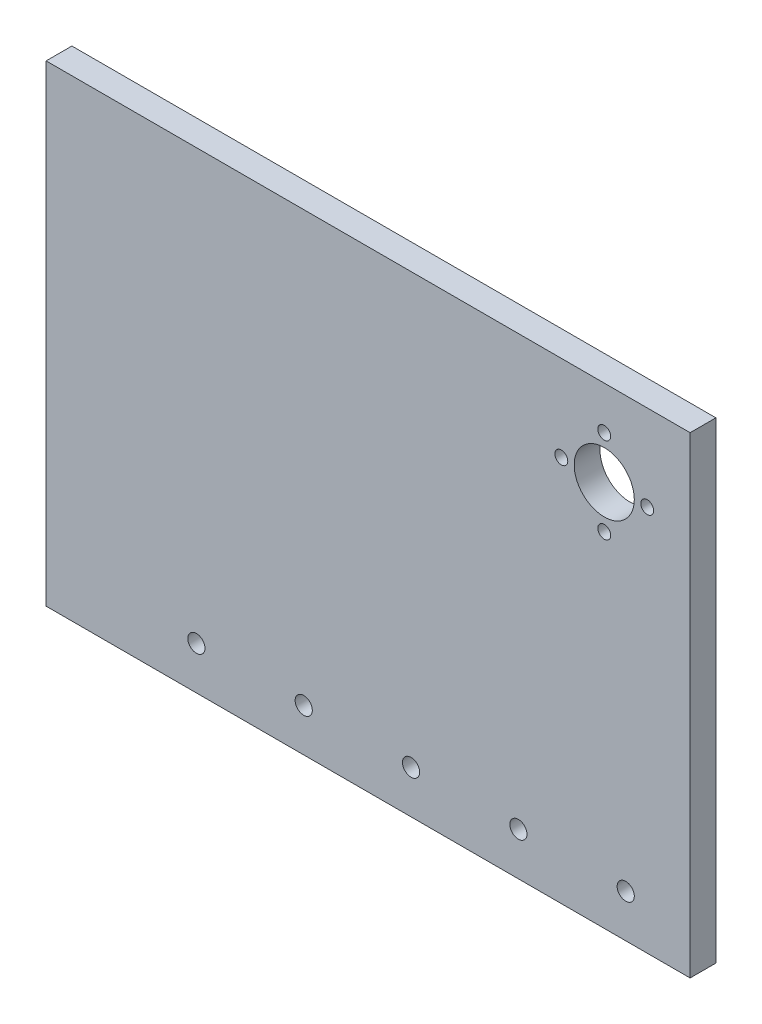
ISO-10303-21;
HEADER;
FILE_DESCRIPTION(('STEP AP214'),'2;1');
FILE_NAME('part.step','',(''),(''),'','','');
FILE_SCHEMA(('AUTOMOTIVE_DESIGN { 1 0 10303 214 1 1 1 1 }'));
ENDSEC;
DATA;
#1=APPLICATION_CONTEXT('core data for automotive mechanical design processes');
#2=APPLICATION_PROTOCOL_DEFINITION('international standard','automotive_design',2000,#1);
#3=PRODUCT_CONTEXT('',#1,'mechanical');
#4=PRODUCT('Part','Part','',(#3));
#5=PRODUCT_RELATED_PRODUCT_CATEGORY('part','',(#4));
#6=PRODUCT_DEFINITION_FORMATION('','',#4);
#7=PRODUCT_DEFINITION_CONTEXT('part definition',#1,'design');
#8=PRODUCT_DEFINITION('design','',#6,#7);
#9=PRODUCT_DEFINITION_SHAPE('','',#8);
#10=(LENGTH_UNIT() NAMED_UNIT(*) SI_UNIT(.MILLI.,.METRE.));
#11=(NAMED_UNIT(*) PLANE_ANGLE_UNIT() SI_UNIT($,.RADIAN.));
#12=(NAMED_UNIT(*) SI_UNIT($,.STERADIAN.) SOLID_ANGLE_UNIT());
#13=UNCERTAINTY_MEASURE_WITH_UNIT(LENGTH_MEASURE(1.E-05),#10,'distance_accuracy_value','');
#14=(GEOMETRIC_REPRESENTATION_CONTEXT(3) GLOBAL_UNCERTAINTY_ASSIGNED_CONTEXT((#13)) GLOBAL_UNIT_ASSIGNED_CONTEXT((#10,
#11,#12)) REPRESENTATION_CONTEXT('',''));
#15=CARTESIAN_POINT('',(0.,0.,0.));
#16=DIRECTION('',(0.,0.,1.));
#17=DIRECTION('',(1.,0.,0.));
#18=AXIS2_PLACEMENT_3D('',#15,#16,#17);
#19=CARTESIAN_POINT('',(0.,0.,6.));
#20=DIRECTION('',(1.,0.,0.));
#21=DIRECTION('',(0.,0.,-1.));
#22=AXIS2_PLACEMENT_3D('',#19,#20,#21);
#23=PLANE('',#22);
#24=DIRECTION('',(0.,-1.,0.));
#25=VECTOR('',#24,1.);
#26=CARTESIAN_POINT('',(0.,0.,0.));
#27=LINE('',#26,#25);
#28=CARTESIAN_POINT('',(0.,110.,0.));
#29=VERTEX_POINT('',#28);
#30=CARTESIAN_POINT('',(0.,0.,0.));
#31=VERTEX_POINT('',#30);
#32=EDGE_CURVE('E96',#29,#31,#27,.T.);
#33=ORIENTED_EDGE('',*,*,#32,.T.);
#34=DIRECTION('',(0.,0.,-1.));
#35=VECTOR('',#34,1.);
#36=CARTESIAN_POINT('',(0.,0.,6.));
#37=LINE('',#36,#35);
#38=CARTESIAN_POINT('',(0.,0.,6.));
#39=VERTEX_POINT('',#38);
#40=EDGE_CURVE('E11',#39,#31,#37,.T.);
#41=ORIENTED_EDGE('',*,*,#40,.F.);
#42=DIRECTION('',(0.,-1.,0.));
#43=VECTOR('',#42,1.);
#44=CARTESIAN_POINT('',(0.,0.,6.));
#45=LINE('',#44,#43);
#46=CARTESIAN_POINT('',(0.,110.,6.));
#47=VERTEX_POINT('',#46);
#48=EDGE_CURVE('E84',#47,#39,#45,.T.);
#49=ORIENTED_EDGE('',*,*,#48,.F.);
#50=DIRECTION('',(0.,0.,-1.));
#51=VECTOR('',#50,1.);
#52=CARTESIAN_POINT('',(0.,110.,6.));
#53=LINE('',#52,#51);
#54=EDGE_CURVE('E92',#47,#29,#53,.T.);
#55=ORIENTED_EDGE('',*,*,#54,.T.);
#56=EDGE_LOOP('',(#33,#41,#49,#55));
#57=FACE_BOUND('',#56,.T.);
#58=ADVANCED_FACE('F33',(#57),#23,.F.);
#59=CARTESIAN_POINT('',(0.,0.,6.));
#60=DIRECTION('',(0.,1.,0.));
#61=DIRECTION('',(0.,0.,1.));
#62=AXIS2_PLACEMENT_3D('',#59,#60,#61);
#63=PLANE('',#62);
#64=DIRECTION('',(1.,0.,0.));
#65=VECTOR('',#64,1.);
#66=CARTESIAN_POINT('',(0.,0.,0.));
#67=LINE('',#66,#65);
#68=CARTESIAN_POINT('',(150.,0.,0.));
#69=VERTEX_POINT('',#68);
#70=EDGE_CURVE('E88',#31,#69,#67,.T.);
#71=ORIENTED_EDGE('',*,*,#70,.T.);
#72=DIRECTION('',(0.,0.,-1.));
#73=VECTOR('',#72,1.);
#74=CARTESIAN_POINT('',(150.,0.,6.));
#75=LINE('',#74,#73);
#76=CARTESIAN_POINT('',(150.,0.,6.));
#77=VERTEX_POINT('',#76);
#78=EDGE_CURVE('E41',#77,#69,#75,.T.);
#79=ORIENTED_EDGE('',*,*,#78,.F.);
#80=DIRECTION('',(1.,0.,0.));
#81=VECTOR('',#80,1.);
#82=CARTESIAN_POINT('',(0.,0.,6.));
#83=LINE('',#82,#81);
#84=EDGE_CURVE('E79',#39,#77,#83,.T.);
#85=ORIENTED_EDGE('',*,*,#84,.F.);
#86=ORIENTED_EDGE('',*,*,#40,.T.);
#87=EDGE_LOOP('',(#71,#79,#85,#86));
#88=FACE_BOUND('',#87,.T.);
#89=ADVANCED_FACE('F87',(#88),#63,.F.);
#90=CARTESIAN_POINT('',(150.,0.,6.));
#91=DIRECTION('',(-1.,0.,0.));
#92=DIRECTION('',(0.,0.,1.));
#93=AXIS2_PLACEMENT_3D('',#90,#91,#92);
#94=PLANE('',#93);
#95=DIRECTION('',(0.,1.,0.));
#96=VECTOR('',#95,1.);
#97=CARTESIAN_POINT('',(150.,0.,0.));
#98=LINE('',#97,#96);
#99=CARTESIAN_POINT('',(150.,110.,0.));
#100=VERTEX_POINT('',#99);
#101=EDGE_CURVE('E66',#69,#100,#98,.T.);
#102=ORIENTED_EDGE('',*,*,#101,.T.);
#103=DIRECTION('',(0.,0.,-1.));
#104=VECTOR('',#103,1.);
#105=CARTESIAN_POINT('',(150.,110.,6.));
#106=LINE('',#105,#104);
#107=CARTESIAN_POINT('',(150.,110.,6.));
#108=VERTEX_POINT('',#107);
#109=EDGE_CURVE('E89',#108,#100,#106,.T.);
#110=ORIENTED_EDGE('',*,*,#109,.F.);
#111=DIRECTION('',(0.,1.,0.));
#112=VECTOR('',#111,1.);
#113=CARTESIAN_POINT('',(150.,0.,6.));
#114=LINE('',#113,#112);
#115=EDGE_CURVE('E82',#77,#108,#114,.T.);
#116=ORIENTED_EDGE('',*,*,#115,.F.);
#117=ORIENTED_EDGE('',*,*,#78,.T.);
#118=EDGE_LOOP('',(#102,#110,#116,#117));
#119=FACE_BOUND('',#118,.T.);
#120=ADVANCED_FACE('F90',(#119),#94,.F.);
#121=CARTESIAN_POINT('',(0.,110.,6.));
#122=DIRECTION('',(0.,-1.,0.));
#123=DIRECTION('',(0.,0.,-1.));
#124=AXIS2_PLACEMENT_3D('',#121,#122,#123);
#125=PLANE('',#124);
#126=DIRECTION('',(-1.,0.,0.));
#127=VECTOR('',#126,1.);
#128=CARTESIAN_POINT('',(0.,110.,0.));
#129=LINE('',#128,#127);
#130=EDGE_CURVE('E72',#100,#29,#129,.T.);
#131=ORIENTED_EDGE('',*,*,#130,.T.);
#132=ORIENTED_EDGE('',*,*,#54,.F.);
#133=DIRECTION('',(-1.,0.,0.));
#134=VECTOR('',#133,1.);
#135=CARTESIAN_POINT('',(0.,110.,6.));
#136=LINE('',#135,#134);
#137=EDGE_CURVE('E49',#108,#47,#136,.T.);
#138=ORIENTED_EDGE('',*,*,#137,.F.);
#139=ORIENTED_EDGE('',*,*,#109,.T.);
#140=EDGE_LOOP('',(#131,#132,#138,#139));
#141=FACE_BOUND('',#140,.T.);
#142=ADVANCED_FACE('F104',(#141),#125,.F.);
#143=CARTESIAN_POINT('',(0.,0.,6.));
#144=DIRECTION('',(0.,0.,-1.));
#145=DIRECTION('',(-1.,0.,0.));
#146=AXIS2_PLACEMENT_3D('',#143,#144,#145);
#147=PLANE('',#146);
#148=CARTESIAN_POINT('',(140.,90.,6.));
#149=DIRECTION('',(0.,0.,1.));
#150=DIRECTION('',(1.,0.,0.));
#151=AXIS2_PLACEMENT_3D('',#148,#149,#150);
#152=CIRCLE('',#151,1.5);
#153=CARTESIAN_POINT('',(141.5,90.,6.));
#154=VERTEX_POINT('',#153);
#155=EDGE_CURVE('E164',#154,#154,#152,.T.);
#156=ORIENTED_EDGE('',*,*,#155,.F.);
#157=EDGE_LOOP('',(#156));
#158=FACE_BOUND('',#157,.T.);
#159=CARTESIAN_POINT('',(130.,80.,6.));
#160=DIRECTION('',(0.,0.,1.));
#161=DIRECTION('',(1.,0.,0.));
#162=AXIS2_PLACEMENT_3D('',#159,#160,#161);
#163=CIRCLE('',#162,1.5);
#164=CARTESIAN_POINT('',(131.5,80.,6.));
#165=VERTEX_POINT('',#164);
#166=EDGE_CURVE('E158',#165,#165,#163,.T.);
#167=ORIENTED_EDGE('',*,*,#166,.F.);
#168=EDGE_LOOP('',(#167));
#169=FACE_BOUND('',#168,.T.);
#170=CARTESIAN_POINT('',(120.,90.,6.));
#171=DIRECTION('',(0.,0.,1.));
#172=DIRECTION('',(1.,0.,0.));
#173=AXIS2_PLACEMENT_3D('',#170,#171,#172);
#174=CIRCLE('',#173,1.5);
#175=CARTESIAN_POINT('',(121.5,90.,6.));
#176=VERTEX_POINT('',#175);
#177=EDGE_CURVE('E152',#176,#176,#174,.T.);
#178=ORIENTED_EDGE('',*,*,#177,.F.);
#179=EDGE_LOOP('',(#178));
#180=FACE_BOUND('',#179,.T.);
#181=CARTESIAN_POINT('',(130.,100.,6.));
#182=DIRECTION('',(0.,0.,1.));
#183=DIRECTION('',(1.,0.,0.));
#184=AXIS2_PLACEMENT_3D('',#181,#182,#183);
#185=CIRCLE('',#184,1.5);
#186=CARTESIAN_POINT('',(131.5,100.,6.));
#187=VERTEX_POINT('',#186);
#188=EDGE_CURVE('E146',#187,#187,#185,.T.);
#189=ORIENTED_EDGE('',*,*,#188,.F.);
#190=EDGE_LOOP('',(#189));
#191=FACE_BOUND('',#190,.T.);
#192=CARTESIAN_POINT('',(130.,90.,6.));
#193=DIRECTION('',(0.,0.,1.));
#194=DIRECTION('',(1.,0.,0.));
#195=AXIS2_PLACEMENT_3D('',#192,#193,#194);
#196=CIRCLE('',#195,7.00000000000002);
#197=CARTESIAN_POINT('',(137.,90.,6.));
#198=VERTEX_POINT('',#197);
#199=EDGE_CURVE('E140',#198,#198,#196,.T.);
#200=ORIENTED_EDGE('',*,*,#199,.F.);
#201=EDGE_LOOP('',(#200));
#202=FACE_BOUND('',#201,.T.);
#203=CARTESIAN_POINT('',(85.,9.99999999999999,6.));
#204=DIRECTION('',(0.,0.,1.));
#205=DIRECTION('',(1.,0.,0.));
#206=AXIS2_PLACEMENT_3D('',#203,#204,#205);
#207=CIRCLE('',#206,2.);
#208=CARTESIAN_POINT('',(87.,9.99999999999999,6.));
#209=VERTEX_POINT('',#208);
#210=EDGE_CURVE('E128',#209,#209,#207,.T.);
#211=ORIENTED_EDGE('',*,*,#210,.F.);
#212=EDGE_LOOP('',(#211));
#213=FACE_BOUND('',#212,.T.);
#214=CARTESIAN_POINT('',(60.,10.,6.));
#215=DIRECTION('',(0.,0.,1.));
#216=DIRECTION('',(-1.,0.,0.));
#217=AXIS2_PLACEMENT_3D('',#214,#215,#216);
#218=CIRCLE('',#217,2.);
#219=CARTESIAN_POINT('',(58.,10.,6.));
#220=VERTEX_POINT('',#219);
#221=EDGE_CURVE('E135',#220,#220,#218,.T.);
#222=ORIENTED_EDGE('',*,*,#221,.F.);
#223=EDGE_LOOP('',(#222));
#224=FACE_BOUND('',#223,.T.);
#225=CARTESIAN_POINT('',(35.,10.,6.));
#226=DIRECTION('',(0.,0.,1.));
#227=DIRECTION('',(-1.,0.,0.));
#228=AXIS2_PLACEMENT_3D('',#225,#226,#227);
#229=CIRCLE('',#228,2.);
#230=CARTESIAN_POINT('',(33.,10.,6.));
#231=VERTEX_POINT('',#230);
#232=EDGE_CURVE('E116',#231,#231,#229,.T.);
#233=ORIENTED_EDGE('',*,*,#232,.F.);
#234=EDGE_LOOP('',(#233));
#235=FACE_BOUND('',#234,.T.);
#236=CARTESIAN_POINT('',(135.,10.,6.));
#237=DIRECTION('',(0.,0.,1.));
#238=DIRECTION('',(1.,0.,0.));
#239=AXIS2_PLACEMENT_3D('',#236,#237,#238);
#240=CIRCLE('',#239,2.);
#241=CARTESIAN_POINT('',(137.,10.,6.));
#242=VERTEX_POINT('',#241);
#243=EDGE_CURVE('E123',#242,#242,#240,.T.);
#244=ORIENTED_EDGE('',*,*,#243,.F.);
#245=EDGE_LOOP('',(#244));
#246=FACE_BOUND('',#245,.T.);
#247=CARTESIAN_POINT('',(110.,10.,6.));
#248=DIRECTION('',(0.,0.,1.));
#249=DIRECTION('',(1.,0.,0.));
#250=AXIS2_PLACEMENT_3D('',#247,#248,#249);
#251=CIRCLE('',#250,2.);
#252=CARTESIAN_POINT('',(112.,10.,6.));
#253=VERTEX_POINT('',#252);
#254=EDGE_CURVE('E110',#253,#253,#251,.T.);
#255=ORIENTED_EDGE('',*,*,#254,.F.);
#256=EDGE_LOOP('',(#255));
#257=FACE_BOUND('',#256,.T.);
#258=ORIENTED_EDGE('',*,*,#48,.T.);
#259=ORIENTED_EDGE('',*,*,#84,.T.);
#260=ORIENTED_EDGE('',*,*,#115,.T.);
#261=ORIENTED_EDGE('',*,*,#137,.T.);
#262=EDGE_LOOP('',(#258,#259,#260,#261));
#263=FACE_BOUND('',#262,.T.);
#264=ADVANCED_FACE('F80',(#158,#169,#180,#191,#202,#213,#224,#235,#246,#257,#263),#147,.F.);
#265=CARTESIAN_POINT('',(0.,0.,0.));
#266=DIRECTION('',(0.,0.,-1.));
#267=DIRECTION('',(-1.,0.,0.));
#268=AXIS2_PLACEMENT_3D('',#265,#266,#267);
#269=PLANE('',#268);
#270=CARTESIAN_POINT('',(140.,90.,0.));
#271=DIRECTION('',(0.,0.,1.));
#272=DIRECTION('',(1.,0.,0.));
#273=AXIS2_PLACEMENT_3D('',#270,#271,#272);
#274=CIRCLE('',#273,1.5);
#275=CARTESIAN_POINT('',(141.5,90.,0.));
#276=VERTEX_POINT('',#275);
#277=EDGE_CURVE('E149',#276,#276,#274,.T.);
#278=ORIENTED_EDGE('',*,*,#277,.T.);
#279=EDGE_LOOP('',(#278));
#280=FACE_BOUND('',#279,.T.);
#281=CARTESIAN_POINT('',(130.,80.,0.));
#282=DIRECTION('',(0.,0.,1.));
#283=DIRECTION('',(1.,0.,0.));
#284=AXIS2_PLACEMENT_3D('',#281,#282,#283);
#285=CIRCLE('',#284,1.5);
#286=CARTESIAN_POINT('',(131.5,80.,0.));
#287=VERTEX_POINT('',#286);
#288=EDGE_CURVE('E161',#287,#287,#285,.T.);
#289=ORIENTED_EDGE('',*,*,#288,.T.);
#290=EDGE_LOOP('',(#289));
#291=FACE_BOUND('',#290,.T.);
#292=CARTESIAN_POINT('',(120.,90.,0.));
#293=DIRECTION('',(0.,0.,1.));
#294=DIRECTION('',(1.,0.,0.));
#295=AXIS2_PLACEMENT_3D('',#292,#293,#294);
#296=CIRCLE('',#295,1.5);
#297=CARTESIAN_POINT('',(121.5,90.,0.));
#298=VERTEX_POINT('',#297);
#299=EDGE_CURVE('E155',#298,#298,#296,.T.);
#300=ORIENTED_EDGE('',*,*,#299,.T.);
#301=EDGE_LOOP('',(#300));
#302=FACE_BOUND('',#301,.T.);
#303=CARTESIAN_POINT('',(130.,100.,0.));
#304=DIRECTION('',(0.,0.,1.));
#305=DIRECTION('',(1.,0.,0.));
#306=AXIS2_PLACEMENT_3D('',#303,#304,#305);
#307=CIRCLE('',#306,1.5);
#308=CARTESIAN_POINT('',(131.5,100.,0.));
#309=VERTEX_POINT('',#308);
#310=EDGE_CURVE('E143',#309,#309,#307,.T.);
#311=ORIENTED_EDGE('',*,*,#310,.T.);
#312=EDGE_LOOP('',(#311));
#313=FACE_BOUND('',#312,.T.);
#314=CARTESIAN_POINT('',(130.,90.,0.));
#315=DIRECTION('',(0.,0.,1.));
#316=DIRECTION('',(1.,0.,0.));
#317=AXIS2_PLACEMENT_3D('',#314,#315,#316);
#318=CIRCLE('',#317,7.00000000000002);
#319=CARTESIAN_POINT('',(137.,90.,0.));
#320=VERTEX_POINT('',#319);
#321=EDGE_CURVE('E132',#320,#320,#318,.T.);
#322=ORIENTED_EDGE('',*,*,#321,.T.);
#323=EDGE_LOOP('',(#322));
#324=FACE_BOUND('',#323,.T.);
#325=CARTESIAN_POINT('',(85.,9.99999999999999,0.));
#326=DIRECTION('',(0.,0.,1.));
#327=DIRECTION('',(1.,0.,0.));
#328=AXIS2_PLACEMENT_3D('',#325,#326,#327);
#329=CIRCLE('',#328,2.);
#330=CARTESIAN_POINT('',(87.,9.99999999999999,0.));
#331=VERTEX_POINT('',#330);
#332=EDGE_CURVE('E131',#331,#331,#329,.T.);
#333=ORIENTED_EDGE('',*,*,#332,.T.);
#334=EDGE_LOOP('',(#333));
#335=FACE_BOUND('',#334,.T.);
#336=CARTESIAN_POINT('',(60.,10.,0.));
#337=DIRECTION('',(0.,0.,1.));
#338=DIRECTION('',(-1.,0.,0.));
#339=AXIS2_PLACEMENT_3D('',#336,#337,#338);
#340=CIRCLE('',#339,2.);
#341=CARTESIAN_POINT('',(58.,10.,0.));
#342=VERTEX_POINT('',#341);
#343=EDGE_CURVE('E120',#342,#342,#340,.T.);
#344=ORIENTED_EDGE('',*,*,#343,.T.);
#345=EDGE_LOOP('',(#344));
#346=FACE_BOUND('',#345,.T.);
#347=CARTESIAN_POINT('',(35.,10.,0.));
#348=DIRECTION('',(0.,0.,1.));
#349=DIRECTION('',(-1.,0.,0.));
#350=AXIS2_PLACEMENT_3D('',#347,#348,#349);
#351=CIRCLE('',#350,2.);
#352=CARTESIAN_POINT('',(33.,10.,0.));
#353=VERTEX_POINT('',#352);
#354=EDGE_CURVE('E119',#353,#353,#351,.T.);
#355=ORIENTED_EDGE('',*,*,#354,.T.);
#356=EDGE_LOOP('',(#355));
#357=FACE_BOUND('',#356,.T.);
#358=CARTESIAN_POINT('',(135.,10.,0.));
#359=DIRECTION('',(0.,0.,1.));
#360=DIRECTION('',(1.,0.,0.));
#361=AXIS2_PLACEMENT_3D('',#358,#359,#360);
#362=CIRCLE('',#361,2.);
#363=CARTESIAN_POINT('',(137.,10.,0.));
#364=VERTEX_POINT('',#363);
#365=EDGE_CURVE('E113',#364,#364,#362,.T.);
#366=ORIENTED_EDGE('',*,*,#365,.T.);
#367=EDGE_LOOP('',(#366));
#368=FACE_BOUND('',#367,.T.);
#369=CARTESIAN_POINT('',(110.,10.,0.));
#370=DIRECTION('',(0.,0.,1.));
#371=DIRECTION('',(1.,0.,0.));
#372=AXIS2_PLACEMENT_3D('',#369,#370,#371);
#373=CIRCLE('',#372,2.);
#374=CARTESIAN_POINT('',(112.,10.,0.));
#375=VERTEX_POINT('',#374);
#376=EDGE_CURVE('E99',#375,#375,#373,.T.);
#377=ORIENTED_EDGE('',*,*,#376,.T.);
#378=EDGE_LOOP('',(#377));
#379=FACE_BOUND('',#378,.T.);
#380=ORIENTED_EDGE('',*,*,#32,.F.);
#381=ORIENTED_EDGE('',*,*,#130,.F.);
#382=ORIENTED_EDGE('',*,*,#101,.F.);
#383=ORIENTED_EDGE('',*,*,#70,.F.);
#384=EDGE_LOOP('',(#380,#381,#382,#383));
#385=FACE_BOUND('',#384,.T.);
#386=ADVANCED_FACE('F107',(#280,#291,#302,#313,#324,#335,#346,#357,#368,#379,#385),#269,.T.);
#387=CARTESIAN_POINT('',(110.,10.,0.));
#388=DIRECTION('',(0.,0.,1.));
#389=DIRECTION('',(1.,0.,0.));
#390=AXIS2_PLACEMENT_3D('',#387,#388,#389);
#391=CYLINDRICAL_SURFACE('',#390,2.);
#392=ORIENTED_EDGE('',*,*,#376,.F.);
#393=EDGE_LOOP('',(#392));
#394=FACE_BOUND('',#393,.T.);
#395=ORIENTED_EDGE('',*,*,#254,.T.);
#396=EDGE_LOOP('',(#395));
#397=FACE_BOUND('',#396,.T.);
#398=ADVANCED_FACE('F200',(#394,#397),#391,.F.);
#399=CARTESIAN_POINT('',(135.,10.,0.));
#400=DIRECTION('',(0.,0.,1.));
#401=DIRECTION('',(1.,0.,0.));
#402=AXIS2_PLACEMENT_3D('',#399,#400,#401);
#403=CYLINDRICAL_SURFACE('',#402,2.);
#404=ORIENTED_EDGE('',*,*,#365,.F.);
#405=EDGE_LOOP('',(#404));
#406=FACE_BOUND('',#405,.T.);
#407=ORIENTED_EDGE('',*,*,#243,.T.);
#408=EDGE_LOOP('',(#407));
#409=FACE_BOUND('',#408,.T.);
#410=ADVANCED_FACE('F202',(#406,#409),#403,.F.);
#411=CARTESIAN_POINT('',(35.,10.,0.));
#412=DIRECTION('',(0.,0.,1.));
#413=DIRECTION('',(1.,0.,0.));
#414=AXIS2_PLACEMENT_3D('',#411,#412,#413);
#415=CYLINDRICAL_SURFACE('',#414,2.);
#416=ORIENTED_EDGE('',*,*,#354,.F.);
#417=EDGE_LOOP('',(#416));
#418=FACE_BOUND('',#417,.T.);
#419=ORIENTED_EDGE('',*,*,#232,.T.);
#420=EDGE_LOOP('',(#419));
#421=FACE_BOUND('',#420,.T.);
#422=ADVANCED_FACE('F209',(#418,#421),#415,.F.);
#423=CARTESIAN_POINT('',(60.,10.,0.));
#424=DIRECTION('',(0.,0.,1.));
#425=DIRECTION('',(1.,0.,0.));
#426=AXIS2_PLACEMENT_3D('',#423,#424,#425);
#427=CYLINDRICAL_SURFACE('',#426,2.);
#428=ORIENTED_EDGE('',*,*,#343,.F.);
#429=EDGE_LOOP('',(#428));
#430=FACE_BOUND('',#429,.T.);
#431=ORIENTED_EDGE('',*,*,#221,.T.);
#432=EDGE_LOOP('',(#431));
#433=FACE_BOUND('',#432,.T.);
#434=ADVANCED_FACE('F287',(#430,#433),#427,.F.);
#435=CARTESIAN_POINT('',(85.,9.99999999999999,0.));
#436=DIRECTION('',(0.,0.,1.));
#437=DIRECTION('',(1.,0.,0.));
#438=AXIS2_PLACEMENT_3D('',#435,#436,#437);
#439=CYLINDRICAL_SURFACE('',#438,2.);
#440=ORIENTED_EDGE('',*,*,#332,.F.);
#441=EDGE_LOOP('',(#440));
#442=FACE_BOUND('',#441,.T.);
#443=ORIENTED_EDGE('',*,*,#210,.T.);
#444=EDGE_LOOP('',(#443));
#445=FACE_BOUND('',#444,.T.);
#446=ADVANCED_FACE('F285',(#442,#445),#439,.F.);
#447=CARTESIAN_POINT('',(130.,90.,0.));
#448=DIRECTION('',(0.,0.,1.));
#449=DIRECTION('',(1.,0.,0.));
#450=AXIS2_PLACEMENT_3D('',#447,#448,#449);
#451=CYLINDRICAL_SURFACE('',#450,7.00000000000002);
#452=ORIENTED_EDGE('',*,*,#321,.F.);
#453=EDGE_LOOP('',(#452));
#454=FACE_BOUND('',#453,.T.);
#455=ORIENTED_EDGE('',*,*,#199,.T.);
#456=EDGE_LOOP('',(#455));
#457=FACE_BOUND('',#456,.T.);
#458=ADVANCED_FACE('F250',(#454,#457),#451,.F.);
#459=CARTESIAN_POINT('',(130.,100.,0.));
#460=DIRECTION('',(0.,0.,1.));
#461=DIRECTION('',(1.,0.,0.));
#462=AXIS2_PLACEMENT_3D('',#459,#460,#461);
#463=CYLINDRICAL_SURFACE('',#462,1.5);
#464=ORIENTED_EDGE('',*,*,#310,.F.);
#465=EDGE_LOOP('',(#464));
#466=FACE_BOUND('',#465,.T.);
#467=ORIENTED_EDGE('',*,*,#188,.T.);
#468=EDGE_LOOP('',(#467));
#469=FACE_BOUND('',#468,.T.);
#470=ADVANCED_FACE('F244',(#466,#469),#463,.F.);
#471=CARTESIAN_POINT('',(120.,90.,0.));
#472=DIRECTION('',(0.,0.,1.));
#473=DIRECTION('',(1.,0.,0.));
#474=AXIS2_PLACEMENT_3D('',#471,#472,#473);
#475=CYLINDRICAL_SURFACE('',#474,1.5);
#476=ORIENTED_EDGE('',*,*,#299,.F.);
#477=EDGE_LOOP('',(#476));
#478=FACE_BOUND('',#477,.T.);
#479=ORIENTED_EDGE('',*,*,#177,.T.);
#480=EDGE_LOOP('',(#479));
#481=FACE_BOUND('',#480,.T.);
#482=ADVANCED_FACE('F249',(#478,#481),#475,.F.);
#483=CARTESIAN_POINT('',(130.,80.,0.));
#484=DIRECTION('',(0.,0.,1.));
#485=DIRECTION('',(1.,0.,0.));
#486=AXIS2_PLACEMENT_3D('',#483,#484,#485);
#487=CYLINDRICAL_SURFACE('',#486,1.5);
#488=ORIENTED_EDGE('',*,*,#288,.F.);
#489=EDGE_LOOP('',(#488));
#490=FACE_BOUND('',#489,.T.);
#491=ORIENTED_EDGE('',*,*,#166,.T.);
#492=EDGE_LOOP('',(#491));
#493=FACE_BOUND('',#492,.T.);
#494=ADVANCED_FACE('F175',(#490,#493),#487,.F.);
#495=CARTESIAN_POINT('',(140.,90.,0.));
#496=DIRECTION('',(0.,0.,1.));
#497=DIRECTION('',(1.,0.,0.));
#498=AXIS2_PLACEMENT_3D('',#495,#496,#497);
#499=CYLINDRICAL_SURFACE('',#498,1.5);
#500=ORIENTED_EDGE('',*,*,#277,.F.);
#501=EDGE_LOOP('',(#500));
#502=FACE_BOUND('',#501,.T.);
#503=ORIENTED_EDGE('',*,*,#155,.T.);
#504=EDGE_LOOP('',(#503));
#505=FACE_BOUND('',#504,.T.);
#506=ADVANCED_FACE('F172',(#502,#505),#499,.F.);
#507=CLOSED_SHELL('',(#58,#89,#120,#142,#264,#386,#398,#410,#422,#434,#446,#458,#470,#482,#494,#506));
#508=MANIFOLD_SOLID_BREP('B2',#507);
#509=ADVANCED_BREP_SHAPE_REPRESENTATION('',(#18,#508),#14);
#510=SHAPE_DEFINITION_REPRESENTATION(#9,#509);
ENDSEC;
END-ISO-10303-21;
